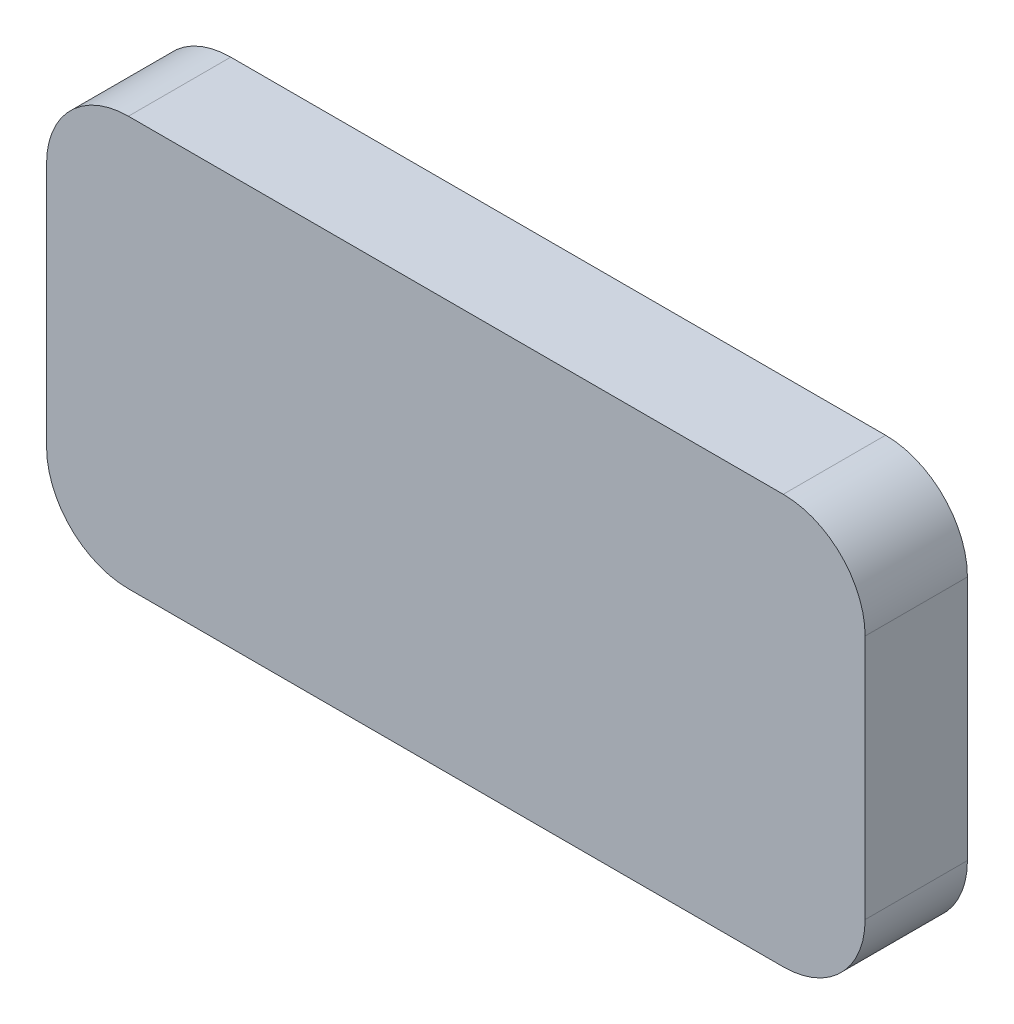
ISO-10303-21;
HEADER;
FILE_DESCRIPTION(('STEP AP214'),'2;1');
FILE_NAME('part.step','',(''),(''),'','','');
FILE_SCHEMA(('AUTOMOTIVE_DESIGN { 1 0 10303 214 1 1 1 1 }'));
ENDSEC;
DATA;
#1=APPLICATION_CONTEXT('core data for automotive mechanical design processes');
#2=APPLICATION_PROTOCOL_DEFINITION('international standard','automotive_design',2000,#1);
#3=PRODUCT_CONTEXT('',#1,'mechanical');
#4=PRODUCT('Part','Part','',(#3));
#5=PRODUCT_RELATED_PRODUCT_CATEGORY('part','',(#4));
#6=PRODUCT_DEFINITION_FORMATION('','',#4);
#7=PRODUCT_DEFINITION_CONTEXT('part definition',#1,'design');
#8=PRODUCT_DEFINITION('design','',#6,#7);
#9=PRODUCT_DEFINITION_SHAPE('','',#8);
#10=(LENGTH_UNIT() NAMED_UNIT(*) SI_UNIT(.MILLI.,.METRE.));
#11=(NAMED_UNIT(*) PLANE_ANGLE_UNIT() SI_UNIT($,.RADIAN.));
#12=(NAMED_UNIT(*) SI_UNIT($,.STERADIAN.) SOLID_ANGLE_UNIT());
#13=UNCERTAINTY_MEASURE_WITH_UNIT(LENGTH_MEASURE(1.E-05),#10,'distance_accuracy_value','');
#14=(GEOMETRIC_REPRESENTATION_CONTEXT(3) GLOBAL_UNCERTAINTY_ASSIGNED_CONTEXT((#13)) GLOBAL_UNIT_ASSIGNED_CONTEXT((#10,
#11,#12)) REPRESENTATION_CONTEXT('',''));
#15=CARTESIAN_POINT('',(0.,0.,0.));
#16=DIRECTION('',(0.,0.,1.));
#17=DIRECTION('',(1.,0.,0.));
#18=AXIS2_PLACEMENT_3D('',#15,#16,#17);
#19=CARTESIAN_POINT('',(16.,6.,5.));
#20=DIRECTION('',(0.,0.,-1.));
#21=DIRECTION('',(-1.,0.,0.));
#22=AXIS2_PLACEMENT_3D('',#19,#20,#21);
#23=CYLINDRICAL_SURFACE('',#22,4.);
#24=CARTESIAN_POINT('',(16.,6.,0.));
#25=DIRECTION('',(0.,0.,1.));
#26=DIRECTION('',(-1.,0.,0.));
#27=AXIS2_PLACEMENT_3D('',#24,#25,#26);
#28=CIRCLE('',#27,4.);
#29=CARTESIAN_POINT('',(20.,5.99999999999997,0.));
#30=VERTEX_POINT('',#29);
#31=CARTESIAN_POINT('',(16.,10.,0.));
#32=VERTEX_POINT('',#31);
#33=EDGE_CURVE('E132',#30,#32,#28,.T.);
#34=ORIENTED_EDGE('',*,*,#33,.T.);
#35=DIRECTION('',(0.,0.,-1.));
#36=VECTOR('',#35,1.);
#37=CARTESIAN_POINT('',(16.,10.,5.));
#38=LINE('',#37,#36);
#39=CARTESIAN_POINT('',(16.,10.,5.));
#40=VERTEX_POINT('',#39);
#41=EDGE_CURVE('E11',#40,#32,#38,.T.);
#42=ORIENTED_EDGE('',*,*,#41,.F.);
#43=CARTESIAN_POINT('',(16.,6.,5.));
#44=DIRECTION('',(0.,0.,1.));
#45=DIRECTION('',(-1.,0.,0.));
#46=AXIS2_PLACEMENT_3D('',#43,#44,#45);
#47=CIRCLE('',#46,4.);
#48=CARTESIAN_POINT('',(20.,5.99999999999997,5.));
#49=VERTEX_POINT('',#48);
#50=EDGE_CURVE('E146',#49,#40,#47,.T.);
#51=ORIENTED_EDGE('',*,*,#50,.F.);
#52=DIRECTION('',(0.,0.,-1.));
#53=VECTOR('',#52,1.);
#54=CARTESIAN_POINT('',(20.,5.99999999999997,5.));
#55=LINE('',#54,#53);
#56=EDGE_CURVE('E128',#49,#30,#55,.T.);
#57=ORIENTED_EDGE('',*,*,#56,.T.);
#58=EDGE_LOOP('',(#34,#42,#51,#57));
#59=FACE_BOUND('',#58,.T.);
#60=ADVANCED_FACE('F36',(#59),#23,.T.);
#61=CARTESIAN_POINT('',(-16.,10.,5.));
#62=DIRECTION('',(0.,-1.,0.));
#63=DIRECTION('',(0.,0.,-1.));
#64=AXIS2_PLACEMENT_3D('',#61,#62,#63);
#65=PLANE('',#64);
#66=DIRECTION('',(-1.,0.,0.));
#67=VECTOR('',#66,1.);
#68=CARTESIAN_POINT('',(-16.,10.,0.));
#69=LINE('',#68,#67);
#70=CARTESIAN_POINT('',(-16.,10.,0.));
#71=VERTEX_POINT('',#70);
#72=EDGE_CURVE('E135',#32,#71,#69,.T.);
#73=ORIENTED_EDGE('',*,*,#72,.T.);
#74=DIRECTION('',(0.,0.,-1.));
#75=VECTOR('',#74,1.);
#76=CARTESIAN_POINT('',(-16.,10.,5.));
#77=LINE('',#76,#75);
#78=CARTESIAN_POINT('',(-16.,10.,5.));
#79=VERTEX_POINT('',#78);
#80=EDGE_CURVE('E44',#79,#71,#77,.T.);
#81=ORIENTED_EDGE('',*,*,#80,.F.);
#82=DIRECTION('',(-1.,0.,0.));
#83=VECTOR('',#82,1.);
#84=CARTESIAN_POINT('',(-16.,10.,5.));
#85=LINE('',#84,#83);
#86=EDGE_CURVE('E95',#40,#79,#85,.T.);
#87=ORIENTED_EDGE('',*,*,#86,.F.);
#88=ORIENTED_EDGE('',*,*,#41,.T.);
#89=EDGE_LOOP('',(#73,#81,#87,#88));
#90=FACE_BOUND('',#89,.T.);
#91=ADVANCED_FACE('F181',(#90),#65,.F.);
#92=CARTESIAN_POINT('',(-16.,6.,5.));
#93=DIRECTION('',(0.,0.,-1.));
#94=DIRECTION('',(-1.,0.,0.));
#95=AXIS2_PLACEMENT_3D('',#92,#93,#94);
#96=CYLINDRICAL_SURFACE('',#95,4.);
#97=CARTESIAN_POINT('',(-16.,6.,0.));
#98=DIRECTION('',(0.,0.,1.));
#99=DIRECTION('',(-1.,0.,0.));
#100=AXIS2_PLACEMENT_3D('',#97,#98,#99);
#101=CIRCLE('',#100,4.);
#102=CARTESIAN_POINT('',(-20.,5.99999999999997,0.));
#103=VERTEX_POINT('',#102);
#104=EDGE_CURVE('E137',#71,#103,#101,.T.);
#105=ORIENTED_EDGE('',*,*,#104,.T.);
#106=DIRECTION('',(0.,0.,-1.));
#107=VECTOR('',#106,1.);
#108=CARTESIAN_POINT('',(-20.,5.99999999999997,5.));
#109=LINE('',#108,#107);
#110=CARTESIAN_POINT('',(-20.,5.99999999999997,5.));
#111=VERTEX_POINT('',#110);
#112=EDGE_CURVE('E153',#111,#103,#109,.T.);
#113=ORIENTED_EDGE('',*,*,#112,.F.);
#114=CARTESIAN_POINT('',(-16.,6.,5.));
#115=DIRECTION('',(0.,0.,1.));
#116=DIRECTION('',(-1.,0.,0.));
#117=AXIS2_PLACEMENT_3D('',#114,#115,#116);
#118=CIRCLE('',#117,4.);
#119=EDGE_CURVE('E161',#79,#111,#118,.T.);
#120=ORIENTED_EDGE('',*,*,#119,.F.);
#121=ORIENTED_EDGE('',*,*,#80,.T.);
#122=EDGE_LOOP('',(#105,#113,#120,#121));
#123=FACE_BOUND('',#122,.T.);
#124=ADVANCED_FACE('F159',(#123),#96,.T.);
#125=CARTESIAN_POINT('',(-20.,-5.99999999999997,5.));
#126=DIRECTION('',(1.,0.,0.));
#127=DIRECTION('',(0.,0.,-1.));
#128=AXIS2_PLACEMENT_3D('',#125,#126,#127);
#129=PLANE('',#128);
#130=DIRECTION('',(0.,-1.,0.));
#131=VECTOR('',#130,1.);
#132=CARTESIAN_POINT('',(-20.,-5.99999999999997,0.));
#133=LINE('',#132,#131);
#134=CARTESIAN_POINT('',(-20.,-5.99999999999997,0.));
#135=VERTEX_POINT('',#134);
#136=EDGE_CURVE('E139',#103,#135,#133,.T.);
#137=ORIENTED_EDGE('',*,*,#136,.T.);
#138=DIRECTION('',(0.,0.,-1.));
#139=VECTOR('',#138,1.);
#140=CARTESIAN_POINT('',(-20.,-5.99999999999997,5.));
#141=LINE('',#140,#139);
#142=CARTESIAN_POINT('',(-20.,-5.99999999999997,5.));
#143=VERTEX_POINT('',#142);
#144=EDGE_CURVE('E150',#143,#135,#141,.T.);
#145=ORIENTED_EDGE('',*,*,#144,.F.);
#146=DIRECTION('',(0.,-1.,0.));
#147=VECTOR('',#146,1.);
#148=CARTESIAN_POINT('',(-20.,-5.99999999999997,5.));
#149=LINE('',#148,#147);
#150=EDGE_CURVE('E173',#111,#143,#149,.T.);
#151=ORIENTED_EDGE('',*,*,#150,.F.);
#152=ORIENTED_EDGE('',*,*,#112,.T.);
#153=EDGE_LOOP('',(#137,#145,#151,#152));
#154=FACE_BOUND('',#153,.T.);
#155=ADVANCED_FACE('F169',(#154),#129,.F.);
#156=CARTESIAN_POINT('',(-16.,-6.,5.));
#157=DIRECTION('',(0.,0.,-1.));
#158=DIRECTION('',(-1.,0.,0.));
#159=AXIS2_PLACEMENT_3D('',#156,#157,#158);
#160=CYLINDRICAL_SURFACE('',#159,4.);
#161=CARTESIAN_POINT('',(-16.,-6.,0.));
#162=DIRECTION('',(0.,0.,1.));
#163=DIRECTION('',(-1.,0.,0.));
#164=AXIS2_PLACEMENT_3D('',#161,#162,#163);
#165=CIRCLE('',#164,4.);
#166=CARTESIAN_POINT('',(-16.,-10.,0.));
#167=VERTEX_POINT('',#166);
#168=EDGE_CURVE('E141',#135,#167,#165,.T.);
#169=ORIENTED_EDGE('',*,*,#168,.T.);
#170=DIRECTION('',(0.,0.,-1.));
#171=VECTOR('',#170,1.);
#172=CARTESIAN_POINT('',(-16.,-10.,5.));
#173=LINE('',#172,#171);
#174=CARTESIAN_POINT('',(-16.,-10.,5.));
#175=VERTEX_POINT('',#174);
#176=EDGE_CURVE('E123',#175,#167,#173,.T.);
#177=ORIENTED_EDGE('',*,*,#176,.F.);
#178=CARTESIAN_POINT('',(-16.,-6.,5.));
#179=DIRECTION('',(0.,0.,1.));
#180=DIRECTION('',(-1.,0.,0.));
#181=AXIS2_PLACEMENT_3D('',#178,#179,#180);
#182=CIRCLE('',#181,4.);
#183=EDGE_CURVE('E114',#143,#175,#182,.T.);
#184=ORIENTED_EDGE('',*,*,#183,.F.);
#185=ORIENTED_EDGE('',*,*,#144,.T.);
#186=EDGE_LOOP('',(#169,#177,#184,#185));
#187=FACE_BOUND('',#186,.T.);
#188=ADVANCED_FACE('F172',(#187),#160,.T.);
#189=CARTESIAN_POINT('',(-16.,-10.,5.));
#190=DIRECTION('',(0.,1.,0.));
#191=DIRECTION('',(0.,0.,1.));
#192=AXIS2_PLACEMENT_3D('',#189,#190,#191);
#193=PLANE('',#192);
#194=DIRECTION('',(1.,0.,0.));
#195=VECTOR('',#194,1.);
#196=CARTESIAN_POINT('',(-16.,-10.,0.));
#197=LINE('',#196,#195);
#198=CARTESIAN_POINT('',(16.,-10.,0.));
#199=VERTEX_POINT('',#198);
#200=EDGE_CURVE('E122',#167,#199,#197,.T.);
#201=ORIENTED_EDGE('',*,*,#200,.T.);
#202=DIRECTION('',(0.,0.,-1.));
#203=VECTOR('',#202,1.);
#204=CARTESIAN_POINT('',(16.,-10.,5.));
#205=LINE('',#204,#203);
#206=CARTESIAN_POINT('',(16.,-10.,5.));
#207=VERTEX_POINT('',#206);
#208=EDGE_CURVE('E119',#207,#199,#205,.T.);
#209=ORIENTED_EDGE('',*,*,#208,.F.);
#210=DIRECTION('',(1.,0.,0.));
#211=VECTOR('',#210,1.);
#212=CARTESIAN_POINT('',(-16.,-10.,5.));
#213=LINE('',#212,#211);
#214=EDGE_CURVE('E108',#175,#207,#213,.T.);
#215=ORIENTED_EDGE('',*,*,#214,.F.);
#216=ORIENTED_EDGE('',*,*,#176,.T.);
#217=EDGE_LOOP('',(#201,#209,#215,#216));
#218=FACE_BOUND('',#217,.T.);
#219=ADVANCED_FACE('F120',(#218),#193,.F.);
#220=CARTESIAN_POINT('',(16.,-6.,5.));
#221=DIRECTION('',(0.,0.,-1.));
#222=DIRECTION('',(-1.,0.,0.));
#223=AXIS2_PLACEMENT_3D('',#220,#221,#222);
#224=CYLINDRICAL_SURFACE('',#223,4.);
#225=CARTESIAN_POINT('',(16.,-6.,0.));
#226=DIRECTION('',(0.,0.,1.));
#227=DIRECTION('',(1.,0.,0.));
#228=AXIS2_PLACEMENT_3D('',#225,#226,#227);
#229=CIRCLE('',#228,4.);
#230=CARTESIAN_POINT('',(20.,-5.99999999999997,0.));
#231=VERTEX_POINT('',#230);
#232=EDGE_CURVE('E81',#199,#231,#229,.T.);
#233=ORIENTED_EDGE('',*,*,#232,.T.);
#234=DIRECTION('',(0.,0.,-1.));
#235=VECTOR('',#234,1.);
#236=CARTESIAN_POINT('',(20.,-5.99999999999997,5.));
#237=LINE('',#236,#235);
#238=CARTESIAN_POINT('',(20.,-5.99999999999997,5.));
#239=VERTEX_POINT('',#238);
#240=EDGE_CURVE('E124',#239,#231,#237,.T.);
#241=ORIENTED_EDGE('',*,*,#240,.F.);
#242=CARTESIAN_POINT('',(16.,-6.,5.));
#243=DIRECTION('',(0.,0.,1.));
#244=DIRECTION('',(1.,0.,0.));
#245=AXIS2_PLACEMENT_3D('',#242,#243,#244);
#246=CIRCLE('',#245,4.);
#247=EDGE_CURVE('E112',#207,#239,#246,.T.);
#248=ORIENTED_EDGE('',*,*,#247,.F.);
#249=ORIENTED_EDGE('',*,*,#208,.T.);
#250=EDGE_LOOP('',(#233,#241,#248,#249));
#251=FACE_BOUND('',#250,.T.);
#252=ADVANCED_FACE('F126',(#251),#224,.T.);
#253=CARTESIAN_POINT('',(20.,-5.99999999999997,5.));
#254=DIRECTION('',(-1.,0.,0.));
#255=DIRECTION('',(0.,0.,1.));
#256=AXIS2_PLACEMENT_3D('',#253,#254,#255);
#257=PLANE('',#256);
#258=DIRECTION('',(0.,1.,0.));
#259=VECTOR('',#258,1.);
#260=CARTESIAN_POINT('',(20.,-5.99999999999997,0.));
#261=LINE('',#260,#259);
#262=EDGE_CURVE('E87',#231,#30,#261,.T.);
#263=ORIENTED_EDGE('',*,*,#262,.T.);
#264=ORIENTED_EDGE('',*,*,#56,.F.);
#265=DIRECTION('',(0.,1.,0.));
#266=VECTOR('',#265,1.);
#267=CARTESIAN_POINT('',(20.,-5.99999999999997,5.));
#268=LINE('',#267,#266);
#269=EDGE_CURVE('E52',#239,#49,#268,.T.);
#270=ORIENTED_EDGE('',*,*,#269,.F.);
#271=ORIENTED_EDGE('',*,*,#240,.T.);
#272=EDGE_LOOP('',(#263,#264,#270,#271));
#273=FACE_BOUND('',#272,.T.);
#274=ADVANCED_FACE('F197',(#273),#257,.F.);
#275=CARTESIAN_POINT('',(16.,6.,5.));
#276=DIRECTION('',(0.,0.,-1.));
#277=DIRECTION('',(-1.,0.,0.));
#278=AXIS2_PLACEMENT_3D('',#275,#276,#277);
#279=PLANE('',#278);
#280=ORIENTED_EDGE('',*,*,#50,.T.);
#281=ORIENTED_EDGE('',*,*,#86,.T.);
#282=ORIENTED_EDGE('',*,*,#119,.T.);
#283=ORIENTED_EDGE('',*,*,#150,.T.);
#284=ORIENTED_EDGE('',*,*,#183,.T.);
#285=ORIENTED_EDGE('',*,*,#214,.T.);
#286=ORIENTED_EDGE('',*,*,#247,.T.);
#287=ORIENTED_EDGE('',*,*,#269,.T.);
#288=EDGE_LOOP('',(#280,#281,#282,#283,#284,#285,#286,#287));
#289=FACE_BOUND('',#288,.T.);
#290=ADVANCED_FACE('F110',(#289),#279,.F.);
#291=CARTESIAN_POINT('',(16.,6.,0.));
#292=DIRECTION('',(0.,0.,-1.));
#293=DIRECTION('',(-1.,0.,0.));
#294=AXIS2_PLACEMENT_3D('',#291,#292,#293);
#295=PLANE('',#294);
#296=ORIENTED_EDGE('',*,*,#33,.F.);
#297=ORIENTED_EDGE('',*,*,#262,.F.);
#298=ORIENTED_EDGE('',*,*,#232,.F.);
#299=ORIENTED_EDGE('',*,*,#200,.F.);
#300=ORIENTED_EDGE('',*,*,#168,.F.);
#301=ORIENTED_EDGE('',*,*,#136,.F.);
#302=ORIENTED_EDGE('',*,*,#104,.F.);
#303=ORIENTED_EDGE('',*,*,#72,.F.);
#304=EDGE_LOOP('',(#296,#297,#298,#299,#300,#301,#302,#303));
#305=FACE_BOUND('',#304,.T.);
#306=ADVANCED_FACE('F165',(#305),#295,.T.);
#307=CLOSED_SHELL('',(#60,#91,#124,#155,#188,#219,#252,#274,#290,#306));
#308=MANIFOLD_SOLID_BREP('B2',#307);
#309=ADVANCED_BREP_SHAPE_REPRESENTATION('',(#18,#308),#14);
#310=SHAPE_DEFINITION_REPRESENTATION(#9,#309);
ENDSEC;
END-ISO-10303-21;
